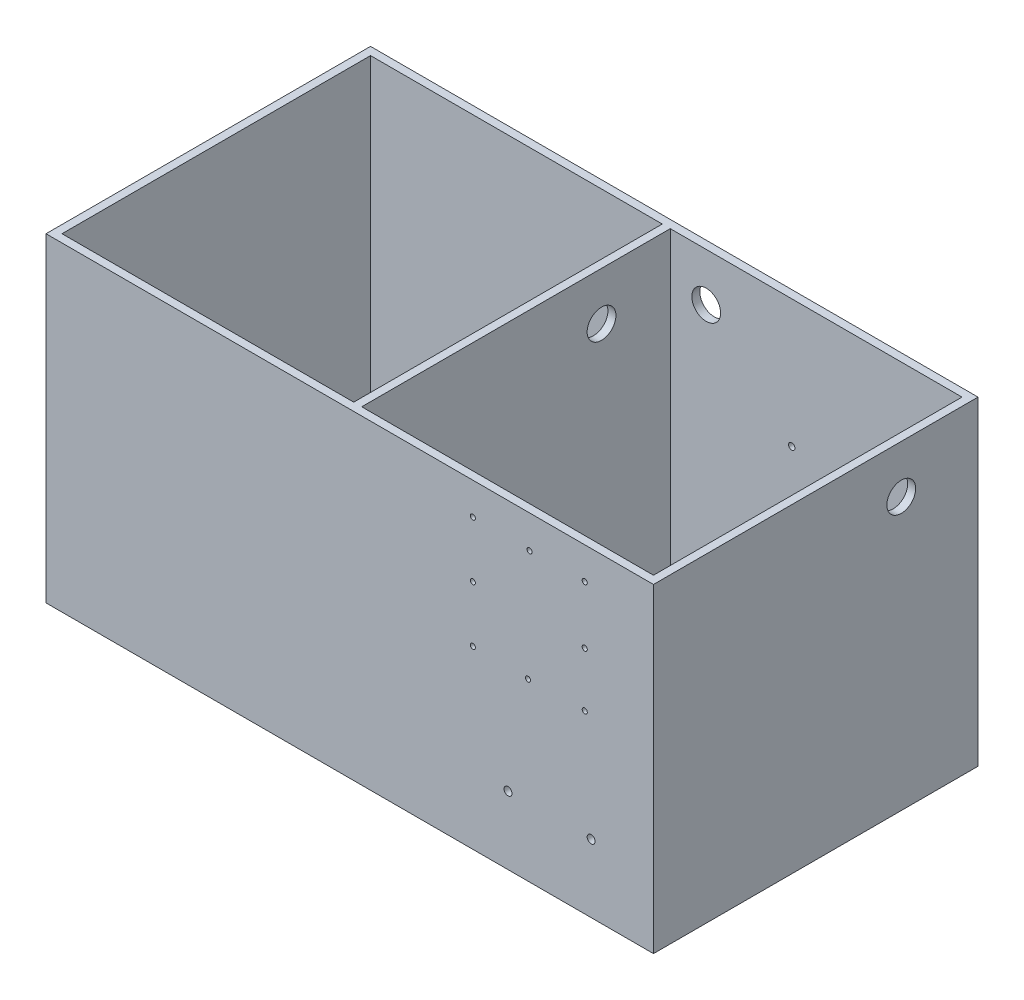
ISO-10303-21;
HEADER;
FILE_DESCRIPTION(('STEP AP214'),'2;1');
FILE_NAME('part.step','',(''),(''),'','','');
FILE_SCHEMA(('AUTOMOTIVE_DESIGN { 1 0 10303 214 1 1 1 1 }'));
ENDSEC;
DATA;
#1=APPLICATION_CONTEXT('core data for automotive mechanical design processes');
#2=APPLICATION_PROTOCOL_DEFINITION('international standard','automotive_design',2000,#1);
#3=PRODUCT_CONTEXT('',#1,'mechanical');
#4=PRODUCT('Part','Part','',(#3));
#5=PRODUCT_RELATED_PRODUCT_CATEGORY('part','',(#4));
#6=PRODUCT_DEFINITION_FORMATION('','',#4);
#7=PRODUCT_DEFINITION_CONTEXT('part definition',#1,'design');
#8=PRODUCT_DEFINITION('design','',#6,#7);
#9=PRODUCT_DEFINITION_SHAPE('','',#8);
#10=(LENGTH_UNIT() NAMED_UNIT(*) SI_UNIT(.MILLI.,.METRE.));
#11=(NAMED_UNIT(*) PLANE_ANGLE_UNIT() SI_UNIT($,.RADIAN.));
#12=(NAMED_UNIT(*) SI_UNIT($,.STERADIAN.) SOLID_ANGLE_UNIT());
#13=UNCERTAINTY_MEASURE_WITH_UNIT(LENGTH_MEASURE(1.E-05),#10,'distance_accuracy_value','');
#14=(GEOMETRIC_REPRESENTATION_CONTEXT(3) GLOBAL_UNCERTAINTY_ASSIGNED_CONTEXT((#13)) GLOBAL_UNIT_ASSIGNED_CONTEXT((#10,
#11,#12)) REPRESENTATION_CONTEXT('',''));
#15=CARTESIAN_POINT('',(0.,0.,0.));
#16=DIRECTION('',(0.,0.,1.));
#17=DIRECTION('',(1.,0.,0.));
#18=AXIS2_PLACEMENT_3D('',#15,#16,#17);
#19=CARTESIAN_POINT('',(-167.,5.,96.5));
#20=DIRECTION('',(0.,0.,1.));
#21=DIRECTION('',(1.,0.,0.));
#22=AXIS2_PLACEMENT_3D('',#19,#20,#21);
#23=PLANE('',#22);
#24=CARTESIAN_POINT('',(77.0000000000001,180.,96.5));
#25=DIRECTION('',(0.,0.,1.));
#26=DIRECTION('',(1.,0.,0.));
#27=AXIS2_PLACEMENT_3D('',#24,#25,#26);
#28=CIRCLE('',#27,1.6);
#29=CARTESIAN_POINT('',(78.6000000000001,180.,96.5));
#30=VERTEX_POINT('',#29);
#31=EDGE_CURVE('E286',#30,#30,#28,.F.);
#32=ORIENTED_EDGE('',*,*,#31,.F.);
#33=EDGE_LOOP('',(#32));
#34=FACE_BOUND('',#33,.T.);
#35=CARTESIAN_POINT('',(147.,110.,96.5));
#36=DIRECTION('',(0.,0.,1.));
#37=DIRECTION('',(1.,0.,0.));
#38=AXIS2_PLACEMENT_3D('',#35,#36,#37);
#39=CIRCLE('',#38,1.59999999999999);
#40=CARTESIAN_POINT('',(148.6,110.,96.5));
#41=VERTEX_POINT('',#40);
#42=EDGE_CURVE('E307',#41,#41,#39,.F.);
#43=ORIENTED_EDGE('',*,*,#42,.F.);
#44=EDGE_LOOP('',(#43));
#45=FACE_BOUND('',#44,.T.);
#46=CARTESIAN_POINT('',(77.0000000000001,110.,96.5));
#47=DIRECTION('',(0.,0.,1.));
#48=DIRECTION('',(1.,0.,0.));
#49=AXIS2_PLACEMENT_3D('',#46,#47,#48);
#50=CIRCLE('',#49,1.60000000000001);
#51=CARTESIAN_POINT('',(78.6000000000001,110.,96.5));
#52=VERTEX_POINT('',#51);
#53=EDGE_CURVE('E297',#52,#52,#50,.F.);
#54=ORIENTED_EDGE('',*,*,#53,.F.);
#55=EDGE_LOOP('',(#54));
#56=FACE_BOUND('',#55,.T.);
#57=CARTESIAN_POINT('',(147.,180.,96.5));
#58=DIRECTION('',(0.,0.,1.));
#59=DIRECTION('',(1.,0.,0.));
#60=AXIS2_PLACEMENT_3D('',#57,#58,#59);
#61=CIRCLE('',#60,1.59999999999999);
#62=CARTESIAN_POINT('',(148.6,180.,96.5));
#63=VERTEX_POINT('',#62);
#64=EDGE_CURVE('E296',#63,#63,#61,.F.);
#65=ORIENTED_EDGE('',*,*,#64,.F.);
#66=EDGE_LOOP('',(#65));
#67=FACE_BOUND('',#66,.T.);
#68=CARTESIAN_POINT('',(111.496480130583,109.503621894617,96.5));
#69=DIRECTION('',(0.,0.,1.));
#70=DIRECTION('',(1.,0.,0.));
#71=AXIS2_PLACEMENT_3D('',#68,#69,#70);
#72=CIRCLE('',#71,1.59999999999998);
#73=CARTESIAN_POINT('',(113.096480130583,109.503621894617,96.5));
#74=VERTEX_POINT('',#73);
#75=EDGE_CURVE('E315',#74,#74,#72,.F.);
#76=ORIENTED_EDGE('',*,*,#75,.F.);
#77=EDGE_LOOP('',(#76));
#78=FACE_BOUND('',#77,.T.);
#79=CARTESIAN_POINT('',(146.992858235966,144.0001020252,96.5));
#80=DIRECTION('',(0.,0.,1.));
#81=DIRECTION('',(1.,0.,0.));
#82=AXIS2_PLACEMENT_3D('',#79,#80,#81);
#83=CIRCLE('',#82,1.60000000000002);
#84=CARTESIAN_POINT('',(148.592858235966,144.0001020252,96.5));
#85=VERTEX_POINT('',#84);
#86=EDGE_CURVE('E314',#85,#85,#83,.F.);
#87=ORIENTED_EDGE('',*,*,#86,.F.);
#88=EDGE_LOOP('',(#87));
#89=FACE_BOUND('',#88,.T.);
#90=CARTESIAN_POINT('',(112.496378105383,179.496480130583,96.5));
#91=DIRECTION('',(0.,0.,1.));
#92=DIRECTION('',(1.,0.,0.));
#93=AXIS2_PLACEMENT_3D('',#90,#91,#92);
#94=CIRCLE('',#93,1.59999999999999);
#95=CARTESIAN_POINT('',(114.096378105383,179.496480130583,96.5));
#96=VERTEX_POINT('',#95);
#97=EDGE_CURVE('E322',#96,#96,#94,.F.);
#98=ORIENTED_EDGE('',*,*,#97,.F.);
#99=EDGE_LOOP('',(#98));
#100=FACE_BOUND('',#99,.T.);
#101=CARTESIAN_POINT('',(77.0000000000001,145.,96.5));
#102=DIRECTION('',(0.,0.,1.));
#103=DIRECTION('',(1.,0.,0.));
#104=AXIS2_PLACEMENT_3D('',#101,#102,#103);
#105=CIRCLE('',#104,1.6);
#106=CARTESIAN_POINT('',(78.6000000000001,145.,96.5));
#107=VERTEX_POINT('',#106);
#108=EDGE_CURVE('E310',#107,#107,#105,.F.);
#109=ORIENTED_EDGE('',*,*,#108,.F.);
#110=EDGE_LOOP('',(#109));
#111=FACE_BOUND('',#110,.T.);
#112=CARTESIAN_POINT('',(151.,42.5,96.5));
#113=DIRECTION('',(0.,0.,1.));
#114=DIRECTION('',(1.,0.,0.));
#115=AXIS2_PLACEMENT_3D('',#112,#113,#114);
#116=CIRCLE('',#115,2.5);
#117=CARTESIAN_POINT('',(153.5,42.5,96.5));
#118=VERTEX_POINT('',#117);
#119=EDGE_CURVE('E151',#118,#118,#116,.F.);
#120=ORIENTED_EDGE('',*,*,#119,.F.);
#121=EDGE_LOOP('',(#120));
#122=FACE_BOUND('',#121,.T.);
#123=CARTESIAN_POINT('',(99.0000000000001,42.5,96.5));
#124=DIRECTION('',(0.,0.,1.));
#125=DIRECTION('',(1.,0.,0.));
#126=AXIS2_PLACEMENT_3D('',#123,#124,#125);
#127=CIRCLE('',#126,2.5);
#128=CARTESIAN_POINT('',(101.5,42.5,96.5));
#129=VERTEX_POINT('',#128);
#130=EDGE_CURVE('E318',#129,#129,#127,.F.);
#131=ORIENTED_EDGE('',*,*,#130,.F.);
#132=EDGE_LOOP('',(#131));
#133=FACE_BOUND('',#132,.T.);
#134=DIRECTION('',(0.,-1.,0.));
#135=VECTOR('',#134,1.);
#136=CARTESIAN_POINT('',(2.5,393.064755975812,96.5));
#137=LINE('',#136,#135);
#138=CARTESIAN_POINT('',(2.5,200.,96.5));
#139=VERTEX_POINT('',#138);
#140=CARTESIAN_POINT('',(2.5,5.,96.5));
#141=VERTEX_POINT('',#140);
#142=EDGE_CURVE('E345',#139,#141,#137,.T.);
#143=ORIENTED_EDGE('',*,*,#142,.F.);
#144=DIRECTION('',(1.,0.,0.));
#145=VECTOR('',#144,1.);
#146=CARTESIAN_POINT('',(-167.,200.,96.5));
#147=LINE('',#146,#145);
#148=CARTESIAN_POINT('',(185.,200.,96.5));
#149=VERTEX_POINT('',#148);
#150=EDGE_CURVE('E66',#139,#149,#147,.T.);
#151=ORIENTED_EDGE('',*,*,#150,.T.);
#152=DIRECTION('',(0.,1.,0.));
#153=VECTOR('',#152,1.);
#154=CARTESIAN_POINT('',(185.,5.,96.5));
#155=LINE('',#154,#153);
#156=CARTESIAN_POINT('',(185.,5.,96.5));
#157=VERTEX_POINT('',#156);
#158=EDGE_CURVE('E172',#157,#149,#155,.T.);
#159=ORIENTED_EDGE('',*,*,#158,.F.);
#160=DIRECTION('',(1.,0.,0.));
#161=VECTOR('',#160,1.);
#162=CARTESIAN_POINT('',(185.,5.,96.5));
#163=LINE('',#162,#161);
#164=EDGE_CURVE('E157',#141,#157,#163,.T.);
#165=ORIENTED_EDGE('',*,*,#164,.F.);
#166=EDGE_LOOP('',(#143,#151,#159,#165));
#167=FACE_BOUND('',#166,.T.);
#168=ADVANCED_FACE('F43',(#34,#45,#56,#67,#78,#89,#100,#111,#122,#133,#167),#23,.F.);
#169=DIRECTION('',(0.,-1.,0.));
#170=VECTOR('',#169,1.);
#171=CARTESIAN_POINT('',(-2.5,393.064755975812,96.5));
#172=LINE('',#171,#170);
#173=CARTESIAN_POINT('',(-2.5,200.,96.5));
#174=VERTEX_POINT('',#173);
#175=CARTESIAN_POINT('',(-2.5,5.,96.5));
#176=VERTEX_POINT('',#175);
#177=EDGE_CURVE('E132',#174,#176,#172,.T.);
#178=ORIENTED_EDGE('',*,*,#177,.T.);
#179=CARTESIAN_POINT('',(-185.,5.,96.5));
#180=VERTEX_POINT('',#179);
#181=EDGE_CURVE('E159',#180,#176,#163,.T.);
#182=ORIENTED_EDGE('',*,*,#181,.F.);
#183=DIRECTION('',(0.,1.,0.));
#184=VECTOR('',#183,1.);
#185=CARTESIAN_POINT('',(-185.,5.,96.5));
#186=LINE('',#185,#184);
#187=CARTESIAN_POINT('',(-185.,200.,96.5));
#188=VERTEX_POINT('',#187);
#189=EDGE_CURVE('E155',#180,#188,#186,.T.);
#190=ORIENTED_EDGE('',*,*,#189,.T.);
#191=EDGE_CURVE('E149',#188,#174,#147,.T.);
#192=ORIENTED_EDGE('',*,*,#191,.T.);
#193=EDGE_LOOP('',(#178,#182,#190,#192));
#194=FACE_BOUND('',#193,.T.);
#195=ADVANCED_FACE('F153',(#194),#23,.F.);
#196=CARTESIAN_POINT('',(-185.,5.,-96.5));
#197=DIRECTION('',(0.,0.,-1.));
#198=DIRECTION('',(-1.,0.,0.));
#199=AXIS2_PLACEMENT_3D('',#196,#197,#198);
#200=PLANE('',#199);
#201=CARTESIAN_POINT('',(78.5000000000001,120.,-96.5));
#202=DIRECTION('',(0.,0.,-1.));
#203=DIRECTION('',(-1.,0.,0.));
#204=AXIS2_PLACEMENT_3D('',#201,#202,#203);
#205=CIRCLE('',#204,2.);
#206=CARTESIAN_POINT('',(76.5000000000001,120.,-96.5));
#207=VERTEX_POINT('',#206);
#208=EDGE_CURVE('E368',#207,#207,#205,.F.);
#209=ORIENTED_EDGE('',*,*,#208,.F.);
#210=EDGE_LOOP('',(#209));
#211=FACE_BOUND('',#210,.T.);
#212=CARTESIAN_POINT('',(78.4999999999995,65.,-96.5));
#213=DIRECTION('',(0.,0.,-1.));
#214=DIRECTION('',(-1.,0.,0.));
#215=AXIS2_PLACEMENT_3D('',#212,#213,#214);
#216=CIRCLE('',#215,2.);
#217=CARTESIAN_POINT('',(76.4999999999995,65.,-96.5));
#218=VERTEX_POINT('',#217);
#219=EDGE_CURVE('E361',#218,#218,#216,.F.);
#220=ORIENTED_EDGE('',*,*,#219,.F.);
#221=EDGE_LOOP('',(#220));
#222=FACE_BOUND('',#221,.T.);
#223=CARTESIAN_POINT('',(154.999999999999,65.,-96.5));
#224=DIRECTION('',(0.,0.,-1.));
#225=DIRECTION('',(-1.,0.,0.));
#226=AXIS2_PLACEMENT_3D('',#223,#224,#225);
#227=CIRCLE('',#226,2.);
#228=CARTESIAN_POINT('',(152.999999999999,65.,-96.5));
#229=VERTEX_POINT('',#228);
#230=EDGE_CURVE('E380',#229,#229,#227,.F.);
#231=ORIENTED_EDGE('',*,*,#230,.F.);
#232=EDGE_LOOP('',(#231));
#233=FACE_BOUND('',#232,.T.);
#234=CARTESIAN_POINT('',(24.9999999999999,170.,-96.5));
#235=DIRECTION('',(0.,0.,-1.));
#236=DIRECTION('',(-1.,0.,0.));
#237=AXIS2_PLACEMENT_3D('',#234,#235,#236);
#238=CIRCLE('',#237,9.00000000000001);
#239=CARTESIAN_POINT('',(15.9999999999999,170.,-96.5));
#240=VERTEX_POINT('',#239);
#241=EDGE_CURVE('E373',#240,#240,#238,.F.);
#242=ORIENTED_EDGE('',*,*,#241,.F.);
#243=EDGE_LOOP('',(#242));
#244=FACE_BOUND('',#243,.T.);
#245=CARTESIAN_POINT('',(155.,120.,-96.5));
#246=DIRECTION('',(0.,0.,-1.));
#247=DIRECTION('',(-1.,0.,0.));
#248=AXIS2_PLACEMENT_3D('',#245,#246,#247);
#249=CIRCLE('',#248,2.);
#250=CARTESIAN_POINT('',(153.,120.,-96.5));
#251=VERTEX_POINT('',#250);
#252=EDGE_CURVE('E347',#251,#251,#249,.F.);
#253=ORIENTED_EDGE('',*,*,#252,.F.);
#254=EDGE_LOOP('',(#253));
#255=FACE_BOUND('',#254,.T.);
#256=DIRECTION('',(0.,-1.,0.));
#257=VECTOR('',#256,1.);
#258=CARTESIAN_POINT('',(2.5,393.064755975812,-96.5));
#259=LINE('',#258,#257);
#260=CARTESIAN_POINT('',(2.5,200.,-96.5));
#261=VERTEX_POINT('',#260);
#262=CARTESIAN_POINT('',(2.5,5.,-96.5));
#263=VERTEX_POINT('',#262);
#264=EDGE_CURVE('E350',#261,#263,#259,.T.);
#265=ORIENTED_EDGE('',*,*,#264,.T.);
#266=DIRECTION('',(-1.,0.,0.));
#267=VECTOR('',#266,1.);
#268=CARTESIAN_POINT('',(167.,5.,-96.5));
#269=LINE('',#268,#267);
#270=CARTESIAN_POINT('',(185.,5.,-96.5));
#271=VERTEX_POINT('',#270);
#272=EDGE_CURVE('E277',#271,#263,#269,.T.);
#273=ORIENTED_EDGE('',*,*,#272,.F.);
#274=DIRECTION('',(0.,1.,0.));
#275=VECTOR('',#274,1.);
#276=CARTESIAN_POINT('',(185.,5.,-96.5));
#277=LINE('',#276,#275);
#278=CARTESIAN_POINT('',(185.,200.,-96.5));
#279=VERTEX_POINT('',#278);
#280=EDGE_CURVE('E170',#271,#279,#277,.T.);
#281=ORIENTED_EDGE('',*,*,#280,.T.);
#282=DIRECTION('',(-1.,0.,0.));
#283=VECTOR('',#282,1.);
#284=CARTESIAN_POINT('',(-185.,200.,-96.5));
#285=LINE('',#284,#283);
#286=EDGE_CURVE('E272',#279,#261,#285,.T.);
#287=ORIENTED_EDGE('',*,*,#286,.T.);
#288=EDGE_LOOP('',(#265,#273,#281,#287));
#289=FACE_BOUND('',#288,.T.);
#290=ADVANCED_FACE('F235',(#211,#222,#233,#244,#255,#289),#200,.F.);
#291=DIRECTION('',(0.,-1.,0.));
#292=VECTOR('',#291,1.);
#293=CARTESIAN_POINT('',(-2.5,393.064755975812,-96.5));
#294=LINE('',#293,#292);
#295=CARTESIAN_POINT('',(-2.5,200.,-96.5));
#296=VERTEX_POINT('',#295);
#297=CARTESIAN_POINT('',(-2.5,5.,-96.5));
#298=VERTEX_POINT('',#297);
#299=EDGE_CURVE('E58',#296,#298,#294,.T.);
#300=ORIENTED_EDGE('',*,*,#299,.F.);
#301=CARTESIAN_POINT('',(-185.,200.,-96.5));
#302=VERTEX_POINT('',#301);
#303=EDGE_CURVE('E150',#296,#302,#285,.T.);
#304=ORIENTED_EDGE('',*,*,#303,.T.);
#305=DIRECTION('',(0.,1.,0.));
#306=VECTOR('',#305,1.);
#307=CARTESIAN_POINT('',(-185.,5.,-96.5));
#308=LINE('',#307,#306);
#309=CARTESIAN_POINT('',(-185.,5.,-96.5));
#310=VERTEX_POINT('',#309);
#311=EDGE_CURVE('E167',#310,#302,#308,.T.);
#312=ORIENTED_EDGE('',*,*,#311,.F.);
#313=EDGE_CURVE('E280',#298,#310,#269,.T.);
#314=ORIENTED_EDGE('',*,*,#313,.F.);
#315=EDGE_LOOP('',(#300,#304,#312,#314));
#316=FACE_BOUND('',#315,.T.);
#317=ADVANCED_FACE('F247',(#316),#200,.F.);
#318=CARTESIAN_POINT('',(0.,5.,0.));
#319=DIRECTION('',(0.,1.,0.));
#320=DIRECTION('',(0.,0.,1.));
#321=AXIS2_PLACEMENT_3D('',#318,#319,#320);
#322=PLANE('',#321);
#323=ORIENTED_EDGE('',*,*,#272,.T.);
#324=DIRECTION('',(0.,0.,-1.));
#325=VECTOR('',#324,1.);
#326=CARTESIAN_POINT('',(2.5,5.,-96.5));
#327=LINE('',#326,#325);
#328=EDGE_CURVE('E346',#141,#263,#327,.T.);
#329=ORIENTED_EDGE('',*,*,#328,.F.);
#330=ORIENTED_EDGE('',*,*,#164,.T.);
#331=DIRECTION('',(0.,0.,-1.));
#332=VECTOR('',#331,1.);
#333=CARTESIAN_POINT('',(185.,5.,78.4999999999999));
#334=LINE('',#333,#332);
#335=EDGE_CURVE('E281',#157,#271,#334,.T.);
#336=ORIENTED_EDGE('',*,*,#335,.T.);
#337=EDGE_LOOP('',(#323,#329,#330,#336));
#338=FACE_BOUND('',#337,.T.);
#339=ADVANCED_FACE('F240',(#338),#322,.T.);
#340=ORIENTED_EDGE('',*,*,#181,.T.);
#341=DIRECTION('',(0.,0.,1.));
#342=VECTOR('',#341,1.);
#343=CARTESIAN_POINT('',(-2.5,5.,-96.5));
#344=LINE('',#343,#342);
#345=EDGE_CURVE('E136',#298,#176,#344,.T.);
#346=ORIENTED_EDGE('',*,*,#345,.F.);
#347=ORIENTED_EDGE('',*,*,#313,.T.);
#348=DIRECTION('',(0.,0.,1.));
#349=VECTOR('',#348,1.);
#350=CARTESIAN_POINT('',(-185.,5.,-78.4999999999999));
#351=LINE('',#350,#349);
#352=EDGE_CURVE('E174',#310,#180,#351,.T.);
#353=ORIENTED_EDGE('',*,*,#352,.T.);
#354=EDGE_LOOP('',(#340,#346,#347,#353));
#355=FACE_BOUND('',#354,.T.);
#356=ADVANCED_FACE('F579',(#355),#322,.T.);
#357=CARTESIAN_POINT('',(190.,200.,-101.5));
#358=DIRECTION('',(-1.,0.,0.));
#359=DIRECTION('',(0.,0.,1.));
#360=AXIS2_PLACEMENT_3D('',#357,#358,#359);
#361=PLANE('',#360);
#362=CARTESIAN_POINT('',(190.,170.,-53.5));
#363=DIRECTION('',(1.,0.,0.));
#364=DIRECTION('',(0.,0.,-1.));
#365=AXIS2_PLACEMENT_3D('',#362,#363,#364);
#366=CIRCLE('',#365,9.00000000000001);
#367=CARTESIAN_POINT('',(190.,170.,-62.5));
#368=VERTEX_POINT('',#367);
#369=EDGE_CURVE('E268',#368,#368,#366,.T.);
#370=ORIENTED_EDGE('',*,*,#369,.F.);
#371=EDGE_LOOP('',(#370));
#372=FACE_BOUND('',#371,.T.);
#373=DIRECTION('',(0.,0.,-1.));
#374=VECTOR('',#373,1.);
#375=CARTESIAN_POINT('',(190.,0.,-101.5));
#376=LINE('',#375,#374);
#377=CARTESIAN_POINT('',(190.,0.,101.5));
#378=VERTEX_POINT('',#377);
#379=CARTESIAN_POINT('',(190.,0.,-101.5));
#380=VERTEX_POINT('',#379);
#381=EDGE_CURVE('E166',#378,#380,#376,.T.);
#382=ORIENTED_EDGE('',*,*,#381,.T.);
#383=DIRECTION('',(0.,-1.,0.));
#384=VECTOR('',#383,1.);
#385=CARTESIAN_POINT('',(190.,200.,-101.5));
#386=LINE('',#385,#384);
#387=CARTESIAN_POINT('',(190.,200.,-101.5));
#388=VERTEX_POINT('',#387);
#389=EDGE_CURVE('E51',#388,#380,#386,.T.);
#390=ORIENTED_EDGE('',*,*,#389,.F.);
#391=DIRECTION('',(0.,0.,-1.));
#392=VECTOR('',#391,1.);
#393=CARTESIAN_POINT('',(190.,200.,78.5));
#394=LINE('',#393,#392);
#395=CARTESIAN_POINT('',(190.,200.,101.5));
#396=VERTEX_POINT('',#395);
#397=EDGE_CURVE('E178',#396,#388,#394,.T.);
#398=ORIENTED_EDGE('',*,*,#397,.F.);
#399=DIRECTION('',(0.,-1.,0.));
#400=VECTOR('',#399,1.);
#401=CARTESIAN_POINT('',(190.,200.,101.5));
#402=LINE('',#401,#400);
#403=EDGE_CURVE('E11',#396,#378,#402,.T.);
#404=ORIENTED_EDGE('',*,*,#403,.T.);
#405=EDGE_LOOP('',(#382,#390,#398,#404));
#406=FACE_BOUND('',#405,.T.);
#407=ADVANCED_FACE('F45',(#372,#406),#361,.F.);
#408=CARTESIAN_POINT('',(-190.,200.,-101.5));
#409=DIRECTION('',(0.,0.,1.));
#410=DIRECTION('',(1.,0.,0.));
#411=AXIS2_PLACEMENT_3D('',#408,#409,#410);
#412=PLANE('',#411);
#413=CARTESIAN_POINT('',(78.5000000000001,120.,-101.5));
#414=DIRECTION('',(0.,0.,-1.));
#415=DIRECTION('',(-1.,0.,0.));
#416=AXIS2_PLACEMENT_3D('',#413,#414,#415);
#417=CIRCLE('',#416,2.);
#418=CARTESIAN_POINT('',(76.5000000000001,120.,-101.5));
#419=VERTEX_POINT('',#418);
#420=EDGE_CURVE('E358',#419,#419,#417,.T.);
#421=ORIENTED_EDGE('',*,*,#420,.F.);
#422=EDGE_LOOP('',(#421));
#423=FACE_BOUND('',#422,.T.);
#424=CARTESIAN_POINT('',(78.4999999999995,65.,-101.5));
#425=DIRECTION('',(0.,0.,-1.));
#426=DIRECTION('',(-1.,0.,0.));
#427=AXIS2_PLACEMENT_3D('',#424,#425,#426);
#428=CIRCLE('',#427,2.);
#429=CARTESIAN_POINT('',(76.4999999999995,65.,-101.5));
#430=VERTEX_POINT('',#429);
#431=EDGE_CURVE('E364',#430,#430,#428,.T.);
#432=ORIENTED_EDGE('',*,*,#431,.F.);
#433=EDGE_LOOP('',(#432));
#434=FACE_BOUND('',#433,.T.);
#435=CARTESIAN_POINT('',(154.999999999999,65.,-101.5));
#436=DIRECTION('',(0.,0.,-1.));
#437=DIRECTION('',(-1.,0.,0.));
#438=AXIS2_PLACEMENT_3D('',#435,#436,#437);
#439=CIRCLE('',#438,2.);
#440=CARTESIAN_POINT('',(152.999999999999,65.,-101.5));
#441=VERTEX_POINT('',#440);
#442=EDGE_CURVE('E365',#441,#441,#439,.T.);
#443=ORIENTED_EDGE('',*,*,#442,.F.);
#444=EDGE_LOOP('',(#443));
#445=FACE_BOUND('',#444,.T.);
#446=CARTESIAN_POINT('',(24.9999999999999,170.,-101.5));
#447=DIRECTION('',(0.,0.,-1.));
#448=DIRECTION('',(-1.,0.,0.));
#449=AXIS2_PLACEMENT_3D('',#446,#447,#448);
#450=CIRCLE('',#449,9.00000000000001);
#451=CARTESIAN_POINT('',(15.9999999999999,170.,-101.5));
#452=VERTEX_POINT('',#451);
#453=EDGE_CURVE('E376',#452,#452,#450,.T.);
#454=ORIENTED_EDGE('',*,*,#453,.F.);
#455=EDGE_LOOP('',(#454));
#456=FACE_BOUND('',#455,.T.);
#457=CARTESIAN_POINT('',(155.,120.,-101.5));
#458=DIRECTION('',(0.,0.,-1.));
#459=DIRECTION('',(-1.,0.,0.));
#460=AXIS2_PLACEMENT_3D('',#457,#458,#459);
#461=CIRCLE('',#460,2.);
#462=CARTESIAN_POINT('',(153.,120.,-101.5));
#463=VERTEX_POINT('',#462);
#464=EDGE_CURVE('E355',#463,#463,#461,.T.);
#465=ORIENTED_EDGE('',*,*,#464,.F.);
#466=EDGE_LOOP('',(#465));
#467=FACE_BOUND('',#466,.T.);
#468=DIRECTION('',(-1.,0.,0.));
#469=VECTOR('',#468,1.);
#470=CARTESIAN_POINT('',(-190.,0.,-101.5));
#471=LINE('',#470,#469);
#472=CARTESIAN_POINT('',(-190.,0.,-101.5));
#473=VERTEX_POINT('',#472);
#474=EDGE_CURVE('E188',#380,#473,#471,.T.);
#475=ORIENTED_EDGE('',*,*,#474,.T.);
#476=DIRECTION('',(0.,-1.,0.));
#477=VECTOR('',#476,1.);
#478=CARTESIAN_POINT('',(-190.,200.,-101.5));
#479=LINE('',#478,#477);
#480=CARTESIAN_POINT('',(-190.,200.,-101.5));
#481=VERTEX_POINT('',#480);
#482=EDGE_CURVE('E198',#481,#473,#479,.T.);
#483=ORIENTED_EDGE('',*,*,#482,.F.);
#484=DIRECTION('',(-1.,0.,0.));
#485=VECTOR('',#484,1.);
#486=CARTESIAN_POINT('',(167.,200.,-101.5));
#487=LINE('',#486,#485);
#488=EDGE_CURVE('E181',#388,#481,#487,.T.);
#489=ORIENTED_EDGE('',*,*,#488,.F.);
#490=ORIENTED_EDGE('',*,*,#389,.T.);
#491=EDGE_LOOP('',(#475,#483,#489,#490));
#492=FACE_BOUND('',#491,.T.);
#493=ADVANCED_FACE('F204',(#423,#434,#445,#456,#467,#492),#412,.F.);
#494=CARTESIAN_POINT('',(-190.,200.,78.5));
#495=DIRECTION('',(1.,0.,0.));
#496=DIRECTION('',(0.,0.,-1.));
#497=AXIS2_PLACEMENT_3D('',#494,#495,#496);
#498=PLANE('',#497);
#499=DIRECTION('',(0.,0.,1.));
#500=VECTOR('',#499,1.);
#501=CARTESIAN_POINT('',(-190.,0.,78.5));
#502=LINE('',#501,#500);
#503=CARTESIAN_POINT('',(-190.,0.,101.5));
#504=VERTEX_POINT('',#503);
#505=EDGE_CURVE('E191',#473,#504,#502,.T.);
#506=ORIENTED_EDGE('',*,*,#505,.T.);
#507=DIRECTION('',(0.,-1.,0.));
#508=VECTOR('',#507,1.);
#509=CARTESIAN_POINT('',(-190.,200.,101.5));
#510=LINE('',#509,#508);
#511=CARTESIAN_POINT('',(-190.,200.,101.5));
#512=VERTEX_POINT('',#511);
#513=EDGE_CURVE('E185',#512,#504,#510,.T.);
#514=ORIENTED_EDGE('',*,*,#513,.F.);
#515=DIRECTION('',(0.,0.,1.));
#516=VECTOR('',#515,1.);
#517=CARTESIAN_POINT('',(-190.,200.,-78.5));
#518=LINE('',#517,#516);
#519=EDGE_CURVE('E183',#481,#512,#518,.T.);
#520=ORIENTED_EDGE('',*,*,#519,.F.);
#521=ORIENTED_EDGE('',*,*,#482,.T.);
#522=EDGE_LOOP('',(#506,#514,#520,#521));
#523=FACE_BOUND('',#522,.T.);
#524=ADVANCED_FACE('F216',(#523),#498,.F.);
#525=CARTESIAN_POINT('',(-167.,200.,101.5));
#526=DIRECTION('',(0.,0.,-1.));
#527=DIRECTION('',(-1.,0.,0.));
#528=AXIS2_PLACEMENT_3D('',#525,#526,#527);
#529=PLANE('',#528);
#530=CARTESIAN_POINT('',(99.0000000000001,42.5,101.5));
#531=DIRECTION('',(0.,0.,1.));
#532=DIRECTION('',(1.,0.,0.));
#533=AXIS2_PLACEMENT_3D('',#530,#531,#532);
#534=CIRCLE('',#533,2.5);
#535=CARTESIAN_POINT('',(101.5,42.5,101.5));
#536=VERTEX_POINT('',#535);
#537=EDGE_CURVE('E338',#536,#536,#534,.T.);
#538=ORIENTED_EDGE('',*,*,#537,.F.);
#539=EDGE_LOOP('',(#538));
#540=FACE_BOUND('',#539,.T.);
#541=CARTESIAN_POINT('',(151.,42.5,101.5));
#542=DIRECTION('',(0.,0.,1.));
#543=DIRECTION('',(1.,0.,0.));
#544=AXIS2_PLACEMENT_3D('',#541,#542,#543);
#545=CIRCLE('',#544,2.5);
#546=CARTESIAN_POINT('',(153.5,42.5,101.5));
#547=VERTEX_POINT('',#546);
#548=EDGE_CURVE('E335',#547,#547,#545,.T.);
#549=ORIENTED_EDGE('',*,*,#548,.F.);
#550=EDGE_LOOP('',(#549));
#551=FACE_BOUND('',#550,.T.);
#552=CARTESIAN_POINT('',(77.0000000000001,145.,101.5));
#553=DIRECTION('',(0.,0.,1.));
#554=DIRECTION('',(1.,0.,0.));
#555=AXIS2_PLACEMENT_3D('',#552,#553,#554);
#556=CIRCLE('',#555,1.6);
#557=CARTESIAN_POINT('',(78.6000000000001,145.,101.5));
#558=VERTEX_POINT('',#557);
#559=EDGE_CURVE('E328',#558,#558,#556,.T.);
#560=ORIENTED_EDGE('',*,*,#559,.F.);
#561=EDGE_LOOP('',(#560));
#562=FACE_BOUND('',#561,.T.);
#563=CARTESIAN_POINT('',(112.496378105383,179.496480130583,101.5));
#564=DIRECTION('',(0.,0.,1.));
#565=DIRECTION('',(1.,0.,0.));
#566=AXIS2_PLACEMENT_3D('',#563,#564,#565);
#567=CIRCLE('',#566,1.59999999999999);
#568=CARTESIAN_POINT('',(114.096378105383,179.496480130583,101.5));
#569=VERTEX_POINT('',#568);
#570=EDGE_CURVE('E325',#569,#569,#567,.T.);
#571=ORIENTED_EDGE('',*,*,#570,.F.);
#572=EDGE_LOOP('',(#571));
#573=FACE_BOUND('',#572,.T.);
#574=CARTESIAN_POINT('',(146.992858235966,144.0001020252,101.5));
#575=DIRECTION('',(0.,0.,1.));
#576=DIRECTION('',(1.,0.,0.));
#577=AXIS2_PLACEMENT_3D('',#574,#575,#576);
#578=CIRCLE('',#577,1.60000000000002);
#579=CARTESIAN_POINT('',(148.592858235966,144.0001020252,101.5));
#580=VERTEX_POINT('',#579);
#581=EDGE_CURVE('E319',#580,#580,#578,.T.);
#582=ORIENTED_EDGE('',*,*,#581,.F.);
#583=EDGE_LOOP('',(#582));
#584=FACE_BOUND('',#583,.T.);
#585=CARTESIAN_POINT('',(111.496480130583,109.503621894617,101.5));
#586=DIRECTION('',(0.,0.,1.));
#587=DIRECTION('',(1.,0.,0.));
#588=AXIS2_PLACEMENT_3D('',#585,#586,#587);
#589=CIRCLE('',#588,1.59999999999998);
#590=CARTESIAN_POINT('',(113.096480130583,109.503621894617,101.5));
#591=VERTEX_POINT('',#590);
#592=EDGE_CURVE('E311',#591,#591,#589,.T.);
#593=ORIENTED_EDGE('',*,*,#592,.F.);
#594=EDGE_LOOP('',(#593));
#595=FACE_BOUND('',#594,.T.);
#596=CARTESIAN_POINT('',(147.,180.,101.5));
#597=DIRECTION('',(0.,0.,1.));
#598=DIRECTION('',(1.,0.,0.));
#599=AXIS2_PLACEMENT_3D('',#596,#597,#598);
#600=CIRCLE('',#599,1.59999999999999);
#601=CARTESIAN_POINT('',(148.6,180.,101.5));
#602=VERTEX_POINT('',#601);
#603=EDGE_CURVE('E292',#602,#602,#600,.T.);
#604=ORIENTED_EDGE('',*,*,#603,.F.);
#605=EDGE_LOOP('',(#604));
#606=FACE_BOUND('',#605,.T.);
#607=CARTESIAN_POINT('',(77.0000000000001,110.,101.5));
#608=DIRECTION('',(0.,0.,1.));
#609=DIRECTION('',(1.,0.,0.));
#610=AXIS2_PLACEMENT_3D('',#607,#608,#609);
#611=CIRCLE('',#610,1.60000000000001);
#612=CARTESIAN_POINT('',(78.6000000000001,110.,101.5));
#613=VERTEX_POINT('',#612);
#614=EDGE_CURVE('E293',#613,#613,#611,.T.);
#615=ORIENTED_EDGE('',*,*,#614,.F.);
#616=EDGE_LOOP('',(#615));
#617=FACE_BOUND('',#616,.T.);
#618=CARTESIAN_POINT('',(147.,110.,101.5));
#619=DIRECTION('',(0.,0.,1.));
#620=DIRECTION('',(1.,0.,0.));
#621=AXIS2_PLACEMENT_3D('',#618,#619,#620);
#622=CIRCLE('',#621,1.59999999999999);
#623=CARTESIAN_POINT('',(148.6,110.,101.5));
#624=VERTEX_POINT('',#623);
#625=EDGE_CURVE('E300',#624,#624,#622,.T.);
#626=ORIENTED_EDGE('',*,*,#625,.F.);
#627=EDGE_LOOP('',(#626));
#628=FACE_BOUND('',#627,.T.);
#629=CARTESIAN_POINT('',(77.0000000000001,180.,101.5));
#630=DIRECTION('',(0.,0.,1.));
#631=DIRECTION('',(1.,0.,0.));
#632=AXIS2_PLACEMENT_3D('',#629,#630,#631);
#633=CIRCLE('',#632,1.6);
#634=CARTESIAN_POINT('',(78.6000000000001,180.,101.5));
#635=VERTEX_POINT('',#634);
#636=EDGE_CURVE('E289',#635,#635,#633,.T.);
#637=ORIENTED_EDGE('',*,*,#636,.F.);
#638=EDGE_LOOP('',(#637));
#639=FACE_BOUND('',#638,.T.);
#640=DIRECTION('',(1.,0.,0.));
#641=VECTOR('',#640,1.);
#642=CARTESIAN_POINT('',(-167.,0.,101.5));
#643=LINE('',#642,#641);
#644=EDGE_CURVE('E179',#504,#378,#643,.T.);
#645=ORIENTED_EDGE('',*,*,#644,.T.);
#646=ORIENTED_EDGE('',*,*,#403,.F.);
#647=DIRECTION('',(1.,0.,0.));
#648=VECTOR('',#647,1.);
#649=CARTESIAN_POINT('',(190.,200.,101.5));
#650=LINE('',#649,#648);
#651=EDGE_CURVE('E175',#512,#396,#650,.T.);
#652=ORIENTED_EDGE('',*,*,#651,.F.);
#653=ORIENTED_EDGE('',*,*,#513,.T.);
#654=EDGE_LOOP('',(#645,#646,#652,#653));
#655=FACE_BOUND('',#654,.T.);
#656=ADVANCED_FACE('F211',(#540,#551,#562,#573,#584,#595,#606,#617,#628,#639,#655),#529,.F.);
#657=CARTESIAN_POINT('',(0.,200.,0.));
#658=DIRECTION('',(0.,1.,0.));
#659=DIRECTION('',(0.,0.,1.));
#660=AXIS2_PLACEMENT_3D('',#657,#658,#659);
#661=PLANE('',#660);
#662=ORIENTED_EDGE('',*,*,#150,.F.);
#663=DIRECTION('',(0.,0.,-1.));
#664=VECTOR('',#663,1.);
#665=CARTESIAN_POINT('',(2.5,200.,-96.5));
#666=LINE('',#665,#664);
#667=EDGE_CURVE('E141',#139,#261,#666,.T.);
#668=ORIENTED_EDGE('',*,*,#667,.T.);
#669=ORIENTED_EDGE('',*,*,#286,.F.);
#670=DIRECTION('',(0.,0.,-1.));
#671=VECTOR('',#670,1.);
#672=CARTESIAN_POINT('',(185.,200.,-96.5));
#673=LINE('',#672,#671);
#674=EDGE_CURVE('E264',#149,#279,#673,.T.);
#675=ORIENTED_EDGE('',*,*,#674,.F.);
#676=EDGE_LOOP('',(#662,#668,#669,#675));
#677=FACE_BOUND('',#676,.T.);
#678=ORIENTED_EDGE('',*,*,#191,.F.);
#679=DIRECTION('',(0.,0.,1.));
#680=VECTOR('',#679,1.);
#681=CARTESIAN_POINT('',(-185.,200.,78.4999999999999));
#682=LINE('',#681,#680);
#683=EDGE_CURVE('E161',#302,#188,#682,.T.);
#684=ORIENTED_EDGE('',*,*,#683,.F.);
#685=ORIENTED_EDGE('',*,*,#303,.F.);
#686=DIRECTION('',(0.,0.,1.));
#687=VECTOR('',#686,1.);
#688=CARTESIAN_POINT('',(-2.5,200.,-96.5));
#689=LINE('',#688,#687);
#690=EDGE_CURVE('E135',#296,#174,#689,.T.);
#691=ORIENTED_EDGE('',*,*,#690,.T.);
#692=EDGE_LOOP('',(#678,#684,#685,#691));
#693=FACE_BOUND('',#692,.T.);
#694=ORIENTED_EDGE('',*,*,#651,.T.);
#695=ORIENTED_EDGE('',*,*,#397,.T.);
#696=ORIENTED_EDGE('',*,*,#488,.T.);
#697=ORIENTED_EDGE('',*,*,#519,.T.);
#698=EDGE_LOOP('',(#694,#695,#696,#697));
#699=FACE_BOUND('',#698,.T.);
#700=ADVANCED_FACE('F146',(#677,#693,#699),#661,.T.);
#701=CARTESIAN_POINT('',(0.,0.,0.));
#702=DIRECTION('',(0.,1.,0.));
#703=DIRECTION('',(0.,0.,1.));
#704=AXIS2_PLACEMENT_3D('',#701,#702,#703);
#705=PLANE('',#704);
#706=ORIENTED_EDGE('',*,*,#381,.F.);
#707=ORIENTED_EDGE('',*,*,#644,.F.);
#708=ORIENTED_EDGE('',*,*,#505,.F.);
#709=ORIENTED_EDGE('',*,*,#474,.F.);
#710=EDGE_LOOP('',(#706,#707,#708,#709));
#711=FACE_BOUND('',#710,.T.);
#712=ADVANCED_FACE('F209',(#711),#705,.F.);
#713=CARTESIAN_POINT('',(-185.,5.,78.4999999999999));
#714=DIRECTION('',(-1.,0.,0.));
#715=DIRECTION('',(0.,0.,1.));
#716=AXIS2_PLACEMENT_3D('',#713,#714,#715);
#717=PLANE('',#716);
#718=ORIENTED_EDGE('',*,*,#683,.T.);
#719=ORIENTED_EDGE('',*,*,#189,.F.);
#720=ORIENTED_EDGE('',*,*,#352,.F.);
#721=ORIENTED_EDGE('',*,*,#311,.T.);
#722=EDGE_LOOP('',(#718,#719,#720,#721));
#723=FACE_BOUND('',#722,.T.);
#724=ADVANCED_FACE('F224',(#723),#717,.F.);
#725=CARTESIAN_POINT('',(185.,5.,-96.5));
#726=DIRECTION('',(1.,0.,0.));
#727=DIRECTION('',(0.,0.,-1.));
#728=AXIS2_PLACEMENT_3D('',#725,#726,#727);
#729=PLANE('',#728);
#730=CARTESIAN_POINT('',(185.,170.,-53.5));
#731=DIRECTION('',(1.,0.,0.));
#732=DIRECTION('',(0.,0.,-1.));
#733=AXIS2_PLACEMENT_3D('',#730,#731,#732);
#734=CIRCLE('',#733,9.00000000000001);
#735=CARTESIAN_POINT('',(185.,170.,-62.5));
#736=VERTEX_POINT('',#735);
#737=EDGE_CURVE('E260',#736,#736,#734,.F.);
#738=ORIENTED_EDGE('',*,*,#737,.F.);
#739=EDGE_LOOP('',(#738));
#740=FACE_BOUND('',#739,.T.);
#741=ORIENTED_EDGE('',*,*,#674,.T.);
#742=ORIENTED_EDGE('',*,*,#280,.F.);
#743=ORIENTED_EDGE('',*,*,#335,.F.);
#744=ORIENTED_EDGE('',*,*,#158,.T.);
#745=EDGE_LOOP('',(#741,#742,#743,#744));
#746=FACE_BOUND('',#745,.T.);
#747=ADVANCED_FACE('F244',(#740,#746),#729,.F.);
#748=CARTESIAN_POINT('',(-190.001,170.,-53.4999999999999));
#749=DIRECTION('',(1.,0.,0.));
#750=DIRECTION('',(0.,0.,-1.));
#751=AXIS2_PLACEMENT_3D('',#748,#749,#750);
#752=CYLINDRICAL_SURFACE('',#751,9.00000000000001);
#753=ORIENTED_EDGE('',*,*,#369,.T.);
#754=EDGE_LOOP('',(#753));
#755=FACE_BOUND('',#754,.T.);
#756=ORIENTED_EDGE('',*,*,#737,.T.);
#757=EDGE_LOOP('',(#756));
#758=FACE_BOUND('',#757,.T.);
#759=ADVANCED_FACE('F250',(#755,#758),#752,.F.);
#760=CARTESIAN_POINT('',(77.0000000000001,180.,-101.501));
#761=DIRECTION('',(0.,0.,1.));
#762=DIRECTION('',(1.,0.,0.));
#763=AXIS2_PLACEMENT_3D('',#760,#761,#762);
#764=CYLINDRICAL_SURFACE('',#763,1.6);
#765=ORIENTED_EDGE('',*,*,#636,.T.);
#766=EDGE_LOOP('',(#765));
#767=FACE_BOUND('',#766,.T.);
#768=ORIENTED_EDGE('',*,*,#31,.T.);
#769=EDGE_LOOP('',(#768));
#770=FACE_BOUND('',#769,.T.);
#771=ADVANCED_FACE('F255',(#767,#770),#764,.F.);
#772=CARTESIAN_POINT('',(147.,110.,-101.501));
#773=DIRECTION('',(0.,0.,1.));
#774=DIRECTION('',(1.,0.,0.));
#775=AXIS2_PLACEMENT_3D('',#772,#773,#774);
#776=CYLINDRICAL_SURFACE('',#775,1.59999999999999);
#777=ORIENTED_EDGE('',*,*,#625,.T.);
#778=EDGE_LOOP('',(#777));
#779=FACE_BOUND('',#778,.T.);
#780=ORIENTED_EDGE('',*,*,#42,.T.);
#781=EDGE_LOOP('',(#780));
#782=FACE_BOUND('',#781,.T.);
#783=ADVANCED_FACE('F433',(#779,#782),#776,.F.);
#784=CARTESIAN_POINT('',(77.0000000000001,110.,-101.501));
#785=DIRECTION('',(0.,0.,1.));
#786=DIRECTION('',(1.,0.,0.));
#787=AXIS2_PLACEMENT_3D('',#784,#785,#786);
#788=CYLINDRICAL_SURFACE('',#787,1.60000000000001);
#789=ORIENTED_EDGE('',*,*,#614,.T.);
#790=EDGE_LOOP('',(#789));
#791=FACE_BOUND('',#790,.T.);
#792=ORIENTED_EDGE('',*,*,#53,.T.);
#793=EDGE_LOOP('',(#792));
#794=FACE_BOUND('',#793,.T.);
#795=ADVANCED_FACE('F436',(#791,#794),#788,.F.);
#796=CARTESIAN_POINT('',(147.,180.,-101.501));
#797=DIRECTION('',(0.,0.,1.));
#798=DIRECTION('',(1.,0.,0.));
#799=AXIS2_PLACEMENT_3D('',#796,#797,#798);
#800=CYLINDRICAL_SURFACE('',#799,1.59999999999999);
#801=ORIENTED_EDGE('',*,*,#603,.T.);
#802=EDGE_LOOP('',(#801));
#803=FACE_BOUND('',#802,.T.);
#804=ORIENTED_EDGE('',*,*,#64,.T.);
#805=EDGE_LOOP('',(#804));
#806=FACE_BOUND('',#805,.T.);
#807=ADVANCED_FACE('F431',(#803,#806),#800,.F.);
#808=CARTESIAN_POINT('',(111.496480130583,109.503621894617,-101.501));
#809=DIRECTION('',(0.,0.,1.));
#810=DIRECTION('',(1.,0.,0.));
#811=AXIS2_PLACEMENT_3D('',#808,#809,#810);
#812=CYLINDRICAL_SURFACE('',#811,1.59999999999998);
#813=ORIENTED_EDGE('',*,*,#592,.T.);
#814=EDGE_LOOP('',(#813));
#815=FACE_BOUND('',#814,.T.);
#816=ORIENTED_EDGE('',*,*,#75,.T.);
#817=EDGE_LOOP('',(#816));
#818=FACE_BOUND('',#817,.T.);
#819=ADVANCED_FACE('F427',(#815,#818),#812,.F.);
#820=CARTESIAN_POINT('',(146.992858235966,144.0001020252,-101.501));
#821=DIRECTION('',(0.,0.,1.));
#822=DIRECTION('',(1.,0.,0.));
#823=AXIS2_PLACEMENT_3D('',#820,#821,#822);
#824=CYLINDRICAL_SURFACE('',#823,1.60000000000002);
#825=ORIENTED_EDGE('',*,*,#581,.T.);
#826=EDGE_LOOP('',(#825));
#827=FACE_BOUND('',#826,.T.);
#828=ORIENTED_EDGE('',*,*,#86,.T.);
#829=EDGE_LOOP('',(#828));
#830=FACE_BOUND('',#829,.T.);
#831=ADVANCED_FACE('F423',(#827,#830),#824,.F.);
#832=CARTESIAN_POINT('',(112.496378105383,179.496480130583,-101.501));
#833=DIRECTION('',(0.,0.,1.));
#834=DIRECTION('',(1.,0.,0.));
#835=AXIS2_PLACEMENT_3D('',#832,#833,#834);
#836=CYLINDRICAL_SURFACE('',#835,1.59999999999999);
#837=ORIENTED_EDGE('',*,*,#570,.T.);
#838=EDGE_LOOP('',(#837));
#839=FACE_BOUND('',#838,.T.);
#840=ORIENTED_EDGE('',*,*,#97,.T.);
#841=EDGE_LOOP('',(#840));
#842=FACE_BOUND('',#841,.T.);
#843=ADVANCED_FACE('F419',(#839,#842),#836,.F.);
#844=CARTESIAN_POINT('',(77.0000000000001,145.,-101.501));
#845=DIRECTION('',(0.,0.,1.));
#846=DIRECTION('',(1.,0.,0.));
#847=AXIS2_PLACEMENT_3D('',#844,#845,#846);
#848=CYLINDRICAL_SURFACE('',#847,1.6);
#849=ORIENTED_EDGE('',*,*,#559,.T.);
#850=EDGE_LOOP('',(#849));
#851=FACE_BOUND('',#850,.T.);
#852=ORIENTED_EDGE('',*,*,#108,.T.);
#853=EDGE_LOOP('',(#852));
#854=FACE_BOUND('',#853,.T.);
#855=ADVANCED_FACE('F415',(#851,#854),#848,.F.);
#856=CARTESIAN_POINT('',(151.,42.5,-101.501));
#857=DIRECTION('',(0.,0.,1.));
#858=DIRECTION('',(1.,0.,0.));
#859=AXIS2_PLACEMENT_3D('',#856,#857,#858);
#860=CYLINDRICAL_SURFACE('',#859,2.5);
#861=ORIENTED_EDGE('',*,*,#548,.T.);
#862=EDGE_LOOP('',(#861));
#863=FACE_BOUND('',#862,.T.);
#864=ORIENTED_EDGE('',*,*,#119,.T.);
#865=EDGE_LOOP('',(#864));
#866=FACE_BOUND('',#865,.T.);
#867=ADVANCED_FACE('F411',(#863,#866),#860,.F.);
#868=CARTESIAN_POINT('',(99.0000000000001,42.5,-101.501));
#869=DIRECTION('',(0.,0.,1.));
#870=DIRECTION('',(1.,0.,0.));
#871=AXIS2_PLACEMENT_3D('',#868,#869,#870);
#872=CYLINDRICAL_SURFACE('',#871,2.5);
#873=ORIENTED_EDGE('',*,*,#537,.T.);
#874=EDGE_LOOP('',(#873));
#875=FACE_BOUND('',#874,.T.);
#876=ORIENTED_EDGE('',*,*,#130,.T.);
#877=EDGE_LOOP('',(#876));
#878=FACE_BOUND('',#877,.T.);
#879=ADVANCED_FACE('F404',(#875,#878),#872,.F.);
#880=CARTESIAN_POINT('',(2.5,393.064755975812,-96.5));
#881=DIRECTION('',(-1.,0.,0.));
#882=DIRECTION('',(0.,0.,1.));
#883=AXIS2_PLACEMENT_3D('',#880,#881,#882);
#884=PLANE('',#883);
#885=CARTESIAN_POINT('',(2.5,170.,-53.5));
#886=DIRECTION('',(1.,0.,0.));
#887=DIRECTION('',(0.,0.,-1.));
#888=AXIS2_PLACEMENT_3D('',#885,#886,#887);
#889=CIRCLE('',#888,9.00000000000001);
#890=CARTESIAN_POINT('',(2.5,170.,-62.5));
#891=VERTEX_POINT('',#890);
#892=EDGE_CURVE('E377',#891,#891,#889,.T.);
#893=ORIENTED_EDGE('',*,*,#892,.F.);
#894=EDGE_LOOP('',(#893));
#895=FACE_BOUND('',#894,.T.);
#896=ORIENTED_EDGE('',*,*,#667,.F.);
#897=ORIENTED_EDGE('',*,*,#142,.T.);
#898=ORIENTED_EDGE('',*,*,#328,.T.);
#899=ORIENTED_EDGE('',*,*,#264,.F.);
#900=EDGE_LOOP('',(#896,#897,#898,#899));
#901=FACE_BOUND('',#900,.T.);
#902=ADVANCED_FACE('F395',(#895,#901),#884,.F.);
#903=CARTESIAN_POINT('',(-2.5,393.064755975812,-96.5));
#904=DIRECTION('',(1.,0.,0.));
#905=DIRECTION('',(0.,0.,-1.));
#906=AXIS2_PLACEMENT_3D('',#903,#904,#905);
#907=PLANE('',#906);
#908=CARTESIAN_POINT('',(-2.5,170.,-53.5));
#909=DIRECTION('',(1.,0.,0.));
#910=DIRECTION('',(0.,0.,-1.));
#911=AXIS2_PLACEMENT_3D('',#908,#909,#910);
#912=CIRCLE('',#911,9.00000000000001);
#913=CARTESIAN_POINT('',(-2.5,170.,-62.5));
#914=VERTEX_POINT('',#913);
#915=EDGE_CURVE('E387',#914,#914,#912,.F.);
#916=ORIENTED_EDGE('',*,*,#915,.F.);
#917=EDGE_LOOP('',(#916));
#918=FACE_BOUND('',#917,.T.);
#919=ORIENTED_EDGE('',*,*,#690,.F.);
#920=ORIENTED_EDGE('',*,*,#299,.T.);
#921=ORIENTED_EDGE('',*,*,#345,.T.);
#922=ORIENTED_EDGE('',*,*,#177,.F.);
#923=EDGE_LOOP('',(#919,#920,#921,#922));
#924=FACE_BOUND('',#923,.T.);
#925=ADVANCED_FACE('F134',(#918,#924),#907,.F.);
#926=CARTESIAN_POINT('',(155.,120.,101.501));
#927=DIRECTION('',(0.,0.,-1.));
#928=DIRECTION('',(-1.,0.,0.));
#929=AXIS2_PLACEMENT_3D('',#926,#927,#928);
#930=CYLINDRICAL_SURFACE('',#929,2.);
#931=ORIENTED_EDGE('',*,*,#464,.T.);
#932=EDGE_LOOP('',(#931));
#933=FACE_BOUND('',#932,.T.);
#934=ORIENTED_EDGE('',*,*,#252,.T.);
#935=EDGE_LOOP('',(#934));
#936=FACE_BOUND('',#935,.T.);
#937=ADVANCED_FACE('F394',(#933,#936),#930,.F.);
#938=CARTESIAN_POINT('',(24.9999999999999,170.,101.501));
#939=DIRECTION('',(0.,0.,-1.));
#940=DIRECTION('',(-1.,0.,0.));
#941=AXIS2_PLACEMENT_3D('',#938,#939,#940);
#942=CYLINDRICAL_SURFACE('',#941,9.00000000000001);
#943=ORIENTED_EDGE('',*,*,#453,.T.);
#944=EDGE_LOOP('',(#943));
#945=FACE_BOUND('',#944,.T.);
#946=ORIENTED_EDGE('',*,*,#241,.T.);
#947=EDGE_LOOP('',(#946));
#948=FACE_BOUND('',#947,.T.);
#949=ADVANCED_FACE('F401',(#945,#948),#942,.F.);
#950=CARTESIAN_POINT('',(154.999999999999,65.,101.501));
#951=DIRECTION('',(0.,0.,-1.));
#952=DIRECTION('',(-1.,0.,0.));
#953=AXIS2_PLACEMENT_3D('',#950,#951,#952);
#954=CYLINDRICAL_SURFACE('',#953,2.);
#955=ORIENTED_EDGE('',*,*,#442,.T.);
#956=EDGE_LOOP('',(#955));
#957=FACE_BOUND('',#956,.T.);
#958=ORIENTED_EDGE('',*,*,#230,.T.);
#959=EDGE_LOOP('',(#958));
#960=FACE_BOUND('',#959,.T.);
#961=ADVANCED_FACE('F529',(#957,#960),#954,.F.);
#962=CARTESIAN_POINT('',(78.4999999999995,65.,101.501));
#963=DIRECTION('',(0.,0.,-1.));
#964=DIRECTION('',(-1.,0.,0.));
#965=AXIS2_PLACEMENT_3D('',#962,#963,#964);
#966=CYLINDRICAL_SURFACE('',#965,2.);
#967=ORIENTED_EDGE('',*,*,#431,.T.);
#968=EDGE_LOOP('',(#967));
#969=FACE_BOUND('',#968,.T.);
#970=ORIENTED_EDGE('',*,*,#219,.T.);
#971=EDGE_LOOP('',(#970));
#972=FACE_BOUND('',#971,.T.);
#973=ADVANCED_FACE('F524',(#969,#972),#966,.F.);
#974=CARTESIAN_POINT('',(78.5000000000001,120.,101.501));
#975=DIRECTION('',(0.,0.,-1.));
#976=DIRECTION('',(-1.,0.,0.));
#977=AXIS2_PLACEMENT_3D('',#974,#975,#976);
#978=CYLINDRICAL_SURFACE('',#977,2.);
#979=ORIENTED_EDGE('',*,*,#420,.T.);
#980=EDGE_LOOP('',(#979));
#981=FACE_BOUND('',#980,.T.);
#982=ORIENTED_EDGE('',*,*,#208,.T.);
#983=EDGE_LOOP('',(#982));
#984=FACE_BOUND('',#983,.T.);
#985=ADVANCED_FACE('F502',(#981,#984),#978,.F.);
#986=CARTESIAN_POINT('',(-190.001,170.,-53.5));
#987=DIRECTION('',(1.,0.,0.));
#988=DIRECTION('',(0.,0.,-1.));
#989=AXIS2_PLACEMENT_3D('',#986,#987,#988);
#990=CYLINDRICAL_SURFACE('',#989,9.00000000000001);
#991=ORIENTED_EDGE('',*,*,#892,.T.);
#992=EDGE_LOOP('',(#991));
#993=FACE_BOUND('',#992,.T.);
#994=ORIENTED_EDGE('',*,*,#915,.T.);
#995=EDGE_LOOP('',(#994));
#996=FACE_BOUND('',#995,.T.);
#997=ADVANCED_FACE('F391',(#993,#996),#990,.F.);
#998=CLOSED_SHELL('',(#168,#195,#290,#317,#339,#356,#407,#493,#524,#656,#700,#712,#724,#747,
#759,#771,#783,#795,#807,#819,#831,#843,#855,#867,#879,#902,#925,#937,#949,#961,#973,#985,#997));
#999=MANIFOLD_SOLID_BREP('B2',#998);
#1000=ADVANCED_BREP_SHAPE_REPRESENTATION('',(#18,#999),#14);
#1001=SHAPE_DEFINITION_REPRESENTATION(#9,#1000);
ENDSEC;
END-ISO-10303-21;
